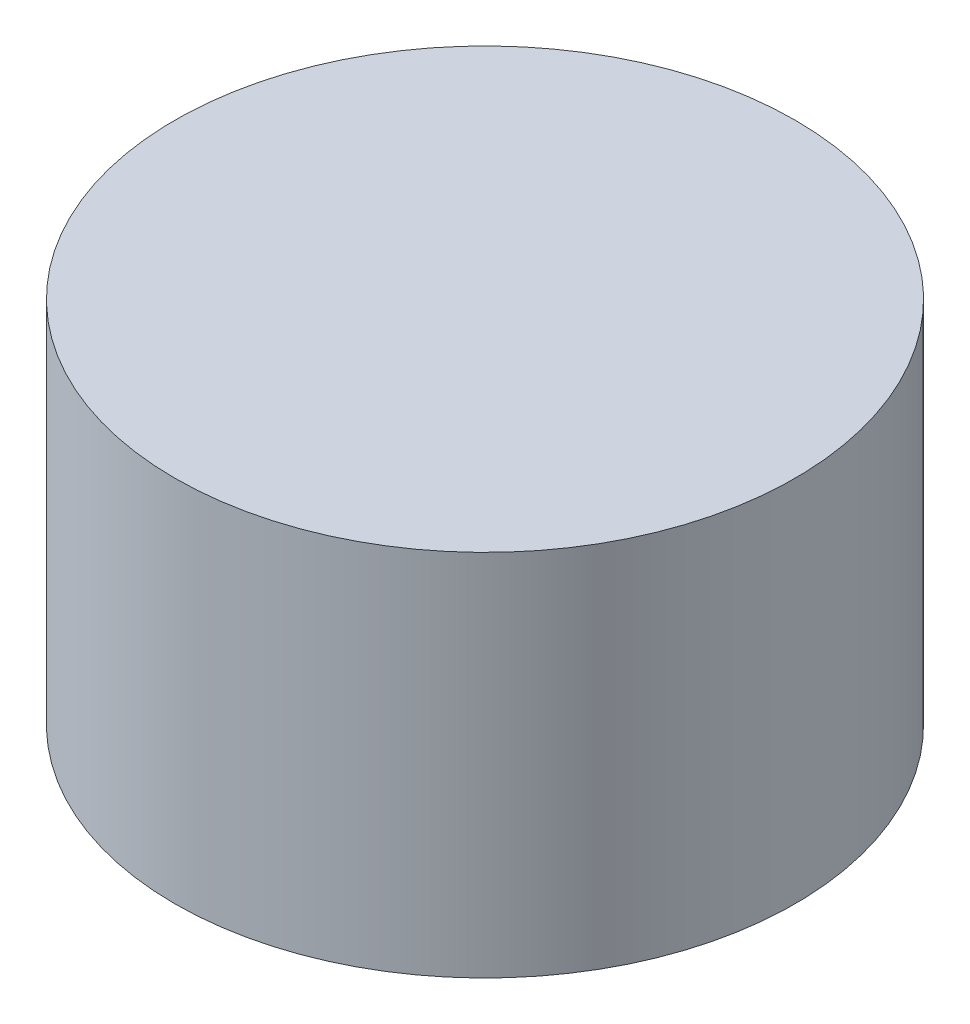
ISO-10303-21;
HEADER;
FILE_DESCRIPTION(('STEP AP214'),'2;1');
FILE_NAME('part.step','',(''),(''),'','','');
FILE_SCHEMA(('AUTOMOTIVE_DESIGN { 1 0 10303 214 1 1 1 1 }'));
ENDSEC;
DATA;
#1=APPLICATION_CONTEXT('core data for automotive mechanical design processes');
#2=APPLICATION_PROTOCOL_DEFINITION('international standard','automotive_design',2000,#1);
#3=PRODUCT_CONTEXT('',#1,'mechanical');
#4=PRODUCT('Part','Part','',(#3));
#5=PRODUCT_RELATED_PRODUCT_CATEGORY('part','',(#4));
#6=PRODUCT_DEFINITION_FORMATION('','',#4);
#7=PRODUCT_DEFINITION_CONTEXT('part definition',#1,'design');
#8=PRODUCT_DEFINITION('design','',#6,#7);
#9=PRODUCT_DEFINITION_SHAPE('','',#8);
#10=(LENGTH_UNIT() NAMED_UNIT(*) SI_UNIT(.MILLI.,.METRE.));
#11=(NAMED_UNIT(*) PLANE_ANGLE_UNIT() SI_UNIT($,.RADIAN.));
#12=(NAMED_UNIT(*) SI_UNIT($,.STERADIAN.) SOLID_ANGLE_UNIT());
#13=UNCERTAINTY_MEASURE_WITH_UNIT(LENGTH_MEASURE(1.E-05),#10,'distance_accuracy_value','');
#14=(GEOMETRIC_REPRESENTATION_CONTEXT(3) GLOBAL_UNCERTAINTY_ASSIGNED_CONTEXT((#13)) GLOBAL_UNIT_ASSIGNED_CONTEXT((#10,
#11,#12)) REPRESENTATION_CONTEXT('',''));
#15=CARTESIAN_POINT('',(0.,0.,0.));
#16=DIRECTION('',(0.,0.,1.));
#17=DIRECTION('',(1.,0.,0.));
#18=AXIS2_PLACEMENT_3D('',#15,#16,#17);
#19=CARTESIAN_POINT('',(0.,6.35,0.));
#20=DIRECTION('',(0.,-1.,0.));
#21=DIRECTION('',(0.,0.,-1.));
#22=AXIS2_PLACEMENT_3D('',#19,#20,#21);
#23=CYLINDRICAL_SURFACE('',#22,9.906);
#24=CARTESIAN_POINT('',(0.,-1.016,0.));
#25=DIRECTION('',(0.,-1.,0.));
#26=DIRECTION('',(0.,0.,-1.));
#27=AXIS2_PLACEMENT_3D('',#24,#25,#26);
#28=CIRCLE('',#27,9.906);
#29=CARTESIAN_POINT('',(0.,-1.016,-9.906));
#30=VERTEX_POINT('',#29);
#31=EDGE_CURVE('E45',#30,#30,#28,.F.);
#32=ORIENTED_EDGE('',*,*,#31,.T.);
#33=EDGE_LOOP('',(#32));
#34=FACE_BOUND('',#33,.T.);
#35=CARTESIAN_POINT('',(0.,0.253999999999997,0.));
#36=DIRECTION('',(0.,1.,0.));
#37=DIRECTION('',(0.,0.,1.));
#38=AXIS2_PLACEMENT_3D('',#35,#36,#37);
#39=CIRCLE('',#38,9.906);
#40=CARTESIAN_POINT('',(0.,0.253999999999997,9.906));
#41=VERTEX_POINT('',#40);
#42=EDGE_CURVE('E49',#41,#41,#39,.F.);
#43=ORIENTED_EDGE('',*,*,#42,.T.);
#44=EDGE_LOOP('',(#43));
#45=FACE_BOUND('',#44,.T.);
#46=ADVANCED_FACE('F41',(#34,#45),#23,.T.);
#47=CARTESIAN_POINT('',(0.,-27.7643990977358,0.));
#48=DIRECTION('',(0.,1.,0.));
#49=DIRECTION('',(0.,0.,1.));
#50=AXIS2_PLACEMENT_3D('',#47,#48,#49);
#51=CYLINDRICAL_SURFACE('',#50,9.525);
#52=CARTESIAN_POINT('',(0.,0.253999999999997,0.));
#53=DIRECTION('',(0.,1.,0.));
#54=DIRECTION('',(0.,0.,1.));
#55=AXIS2_PLACEMENT_3D('',#52,#53,#54);
#56=CIRCLE('',#55,9.525);
#57=CARTESIAN_POINT('',(0.,0.253999999999997,9.525));
#58=VERTEX_POINT('',#57);
#59=EDGE_CURVE('E57',#58,#58,#56,.F.);
#60=ORIENTED_EDGE('',*,*,#59,.F.);
#61=EDGE_LOOP('',(#60));
#62=FACE_BOUND('',#61,.T.);
#63=CARTESIAN_POINT('',(0.,6.35,0.));
#64=DIRECTION('',(0.,1.,0.));
#65=DIRECTION('',(0.,0.,1.));
#66=AXIS2_PLACEMENT_3D('',#63,#64,#65);
#67=CIRCLE('',#66,9.525);
#68=CARTESIAN_POINT('',(0.,6.35,9.525));
#69=VERTEX_POINT('',#68);
#70=EDGE_CURVE('E54',#69,#69,#67,.T.);
#71=ORIENTED_EDGE('',*,*,#70,.F.);
#72=EDGE_LOOP('',(#71));
#73=FACE_BOUND('',#72,.T.);
#74=ADVANCED_FACE('F80',(#62,#73),#51,.T.);
#75=CARTESIAN_POINT('',(-26.7335,0.253999999999999,-12.446));
#76=DIRECTION('',(0.,1.,0.));
#77=DIRECTION('',(-1.,0.,0.));
#78=AXIS2_PLACEMENT_3D('',#75,#76,#77);
#79=PLANE('',#78);
#80=ORIENTED_EDGE('',*,*,#42,.F.);
#81=EDGE_LOOP('',(#80));
#82=FACE_BOUND('',#81,.T.);
#83=ORIENTED_EDGE('',*,*,#59,.T.);
#84=EDGE_LOOP('',(#83));
#85=FACE_BOUND('',#84,.T.);
#86=ADVANCED_FACE('F78',(#82,#85),#79,.T.);
#87=CARTESIAN_POINT('',(0.,6.35,0.));
#88=DIRECTION('',(0.,1.,0.));
#89=DIRECTION('',(0.,0.,1.));
#90=AXIS2_PLACEMENT_3D('',#87,#88,#89);
#91=PLANE('',#90);
#92=CARTESIAN_POINT('',(0.,6.35,0.));
#93=DIRECTION('',(0.,1.,0.));
#94=DIRECTION('',(0.,0.,1.));
#95=AXIS2_PLACEMENT_3D('',#92,#93,#94);
#96=CIRCLE('',#95,6.604);
#97=CARTESIAN_POINT('',(0.,6.35,6.604));
#98=VERTEX_POINT('',#97);
#99=EDGE_CURVE('E61',#98,#98,#96,.T.);
#100=ORIENTED_EDGE('',*,*,#99,.F.);
#101=EDGE_LOOP('',(#100));
#102=FACE_BOUND('',#101,.T.);
#103=ORIENTED_EDGE('',*,*,#70,.T.);
#104=EDGE_LOOP('',(#103));
#105=FACE_BOUND('',#104,.T.);
#106=ADVANCED_FACE('F88',(#102,#105),#91,.T.);
#107=CARTESIAN_POINT('',(0.,-3.048,0.));
#108=DIRECTION('',(0.,1.,0.));
#109=DIRECTION('',(0.,0.,1.));
#110=AXIS2_PLACEMENT_3D('',#107,#108,#109);
#111=TOROIDAL_SURFACE('',#110,12.3455903344619,3.175);
#112=CARTESIAN_POINT('',(0.,-5.08,0.));
#113=DIRECTION('',(0.,1.,0.));
#114=DIRECTION('',(0.,0.,1.));
#115=AXIS2_PLACEMENT_3D('',#112,#113,#114);
#116=CIRCLE('',#115,9.906);
#117=CARTESIAN_POINT('',(0.,-5.08,9.906));
#118=VERTEX_POINT('',#117);
#119=EDGE_CURVE('E59',#118,#118,#116,.F.);
#120=ORIENTED_EDGE('',*,*,#119,.F.);
#121=EDGE_LOOP('',(#120));
#122=FACE_BOUND('',#121,.T.);
#123=ORIENTED_EDGE('',*,*,#31,.F.);
#124=EDGE_LOOP('',(#123));
#125=FACE_BOUND('',#124,.T.);
#126=ADVANCED_FACE('F96',(#122,#125),#111,.F.);
#127=CARTESIAN_POINT('',(0.,-6.35,0.));
#128=DIRECTION('',(0.,1.,0.));
#129=DIRECTION('',(0.,0.,1.));
#130=AXIS2_PLACEMENT_3D('',#127,#128,#129);
#131=PLANE('',#130);
#132=CARTESIAN_POINT('',(0.,-6.35,0.));
#133=DIRECTION('',(0.,-1.,0.));
#134=DIRECTION('',(0.,0.,-1.));
#135=AXIS2_PLACEMENT_3D('',#132,#133,#134);
#136=CIRCLE('',#135,6.604);
#137=CARTESIAN_POINT('',(0.,-6.35,-6.604));
#138=VERTEX_POINT('',#137);
#139=EDGE_CURVE('E66',#138,#138,#136,.T.);
#140=ORIENTED_EDGE('',*,*,#139,.F.);
#141=EDGE_LOOP('',(#140));
#142=FACE_BOUND('',#141,.T.);
#143=CARTESIAN_POINT('',(0.,-6.35,0.));
#144=DIRECTION('',(0.,1.,0.));
#145=DIRECTION('',(0.,0.,1.));
#146=AXIS2_PLACEMENT_3D('',#143,#144,#145);
#147=CIRCLE('',#146,9.906);
#148=CARTESIAN_POINT('',(0.,-6.35,9.906));
#149=VERTEX_POINT('',#148);
#150=EDGE_CURVE('E11',#149,#149,#147,.T.);
#151=ORIENTED_EDGE('',*,*,#150,.F.);
#152=EDGE_LOOP('',(#151));
#153=FACE_BOUND('',#152,.T.);
#154=ADVANCED_FACE('F98',(#142,#153),#131,.F.);
#155=ORIENTED_EDGE('',*,*,#119,.T.);
#156=EDGE_LOOP('',(#155));
#157=FACE_BOUND('',#156,.T.);
#158=ORIENTED_EDGE('',*,*,#150,.T.);
#159=EDGE_LOOP('',(#158));
#160=FACE_BOUND('',#159,.T.);
#161=ADVANCED_FACE('F43',(#157,#160),#23,.T.);
#162=CARTESIAN_POINT('',(0.,6.604,0.));
#163=DIRECTION('',(0.,-1.,0.));
#164=DIRECTION('',(0.,0.,-1.));
#165=AXIS2_PLACEMENT_3D('',#162,#163,#164);
#166=CYLINDRICAL_SURFACE('',#165,6.604);
#167=ORIENTED_EDGE('',*,*,#99,.T.);
#168=EDGE_LOOP('',(#167));
#169=FACE_BOUND('',#168,.T.);
#170=ORIENTED_EDGE('',*,*,#139,.T.);
#171=EDGE_LOOP('',(#170));
#172=FACE_BOUND('',#171,.T.);
#173=ADVANCED_FACE('F105',(#169,#172),#166,.F.);
#174=CLOSED_SHELL('',(#46,#74,#86,#106,#126,#154,#161,#173));
#175=MANIFOLD_SOLID_BREP('B2',#174);
#176=CARTESIAN_POINT('',(0.,6.604,0.));
#177=DIRECTION('',(0.,-1.,0.));
#178=DIRECTION('',(0.,0.,-1.));
#179=AXIS2_PLACEMENT_3D('',#176,#177,#178);
#180=CYLINDRICAL_SURFACE('',#179,11.1125);
#181=CARTESIAN_POINT('',(0.,6.604,0.));
#182=DIRECTION('',(0.,1.,0.));
#183=DIRECTION('',(0.,0.,1.));
#184=AXIS2_PLACEMENT_3D('',#181,#182,#183);
#185=CIRCLE('',#184,11.1125);
#186=CARTESIAN_POINT('',(0.,6.604,-11.1125));
#187=VERTEX_POINT('',#186);
#188=EDGE_CURVE('E40',#187,#187,#185,.T.);
#189=CARTESIAN_POINT('',(0.,-6.604,0.));
#190=DIRECTION('',(0.,1.,0.));
#191=DIRECTION('',(0.,0.,1.));
#192=AXIS2_PLACEMENT_3D('',#189,#190,#191);
#193=CIRCLE('',#192,11.1125);
#194=CARTESIAN_POINT('',(0.,-6.604,-11.1125));
#195=VERTEX_POINT('',#194);
#196=EDGE_CURVE('E164',#195,#195,#193,.T.);
#197=CARTESIAN_POINT('',(0.,6.604,-11.1125));
#198=CARTESIAN_POINT('',(0.,6.46641666666667,-11.1125));
#199=CARTESIAN_POINT('',(0.,6.32883333333333,-11.1125));
#200=CARTESIAN_POINT('',(0.,6.05366666666667,-11.1125));
#201=CARTESIAN_POINT('',(0.,5.91608333333333,-11.1125));
#202=CARTESIAN_POINT('',(0.,5.64091666666667,-11.1125));
#203=CARTESIAN_POINT('',(0.,5.50333333333333,-11.1125));
#204=CARTESIAN_POINT('',(0.,5.22816666666667,-11.1125));
#205=CARTESIAN_POINT('',(0.,5.09058333333333,-11.1125));
#206=CARTESIAN_POINT('',(0.,4.81541666666667,-11.1125));
#207=CARTESIAN_POINT('',(0.,4.67783333333333,-11.1125));
#208=CARTESIAN_POINT('',(0.,4.40266666666667,-11.1125));
#209=CARTESIAN_POINT('',(0.,4.26508333333333,-11.1125));
#210=CARTESIAN_POINT('',(0.,3.98991666666667,-11.1125));
#211=CARTESIAN_POINT('',(0.,3.85233333333333,-11.1125));
#212=CARTESIAN_POINT('',(0.,3.57716666666667,-11.1125));
#213=CARTESIAN_POINT('',(0.,3.43958333333333,-11.1125));
#214=CARTESIAN_POINT('',(0.,3.16441666666667,-11.1125));
#215=CARTESIAN_POINT('',(0.,3.02683333333333,-11.1125));
#216=CARTESIAN_POINT('',(0.,2.75166666666667,-11.1125));
#217=CARTESIAN_POINT('',(0.,2.61408333333333,-11.1125));
#218=CARTESIAN_POINT('',(0.,2.33891666666667,-11.1125));
#219=CARTESIAN_POINT('',(0.,2.20133333333333,-11.1125));
#220=CARTESIAN_POINT('',(0.,1.92616666666667,-11.1125));
#221=CARTESIAN_POINT('',(0.,1.78858333333333,-11.1125));
#222=CARTESIAN_POINT('',(0.,1.51341666666667,-11.1125));
#223=CARTESIAN_POINT('',(0.,1.37583333333333,-11.1125));
#224=CARTESIAN_POINT('',(0.,1.10066666666667,-11.1125));
#225=CARTESIAN_POINT('',(0.,0.963083333333332,-11.1125));
#226=CARTESIAN_POINT('',(0.,0.687916666666666,-11.1125));
#227=CARTESIAN_POINT('',(0.,0.550333333333332,-11.1125));
#228=CARTESIAN_POINT('',(0.,0.275166666666666,-11.1125));
#229=CARTESIAN_POINT('',(0.,0.137583333333332,-11.1125));
#230=CARTESIAN_POINT('',(0.,-0.137583333333334,-11.1125));
#231=CARTESIAN_POINT('',(0.,-0.275166666666668,-11.1125));
#232=CARTESIAN_POINT('',(0.,-0.550333333333334,-11.1125));
#233=CARTESIAN_POINT('',(0.,-0.687916666666667,-11.1125));
#234=CARTESIAN_POINT('',(0.,-0.963083333333333,-11.1125));
#235=CARTESIAN_POINT('',(0.,-1.10066666666667,-11.1125));
#236=CARTESIAN_POINT('',(0.,-1.37583333333333,-11.1125));
#237=CARTESIAN_POINT('',(0.,-1.51341666666667,-11.1125));
#238=CARTESIAN_POINT('',(0.,-1.78858333333333,-11.1125));
#239=CARTESIAN_POINT('',(0.,-1.92616666666667,-11.1125));
#240=CARTESIAN_POINT('',(0.,-2.20133333333333,-11.1125));
#241=CARTESIAN_POINT('',(0.,-2.33891666666667,-11.1125));
#242=CARTESIAN_POINT('',(0.,-2.61408333333333,-11.1125));
#243=CARTESIAN_POINT('',(0.,-2.75166666666667,-11.1125));
#244=CARTESIAN_POINT('',(0.,-3.02683333333333,-11.1125));
#245=CARTESIAN_POINT('',(0.,-3.16441666666667,-11.1125));
#246=CARTESIAN_POINT('',(0.,-3.43958333333333,-11.1125));
#247=CARTESIAN_POINT('',(0.,-3.57716666666667,-11.1125));
#248=CARTESIAN_POINT('',(0.,-3.85233333333333,-11.1125));
#249=CARTESIAN_POINT('',(0.,-3.98991666666667,-11.1125));
#250=CARTESIAN_POINT('',(0.,-4.26508333333333,-11.1125));
#251=CARTESIAN_POINT('',(0.,-4.40266666666667,-11.1125));
#252=CARTESIAN_POINT('',(0.,-4.67783333333333,-11.1125));
#253=CARTESIAN_POINT('',(0.,-4.81541666666667,-11.1125));
#254=CARTESIAN_POINT('',(0.,-5.09058333333333,-11.1125));
#255=CARTESIAN_POINT('',(0.,-5.22816666666667,-11.1125));
#256=CARTESIAN_POINT('',(0.,-5.50333333333333,-11.1125));
#257=CARTESIAN_POINT('',(0.,-5.64091666666667,-11.1125));
#258=CARTESIAN_POINT('',(0.,-5.91608333333333,-11.1125));
#259=CARTESIAN_POINT('',(0.,-6.05366666666667,-11.1125));
#260=CARTESIAN_POINT('',(0.,-6.32883333333333,-11.1125));
#261=CARTESIAN_POINT('',(0.,-6.46641666666667,-11.1125));
#262=CARTESIAN_POINT('',(0.,-6.604,-11.1125));
#263=B_SPLINE_CURVE_WITH_KNOTS('',3,(#197,#198,#199,#200,#201,#202,#203,#204,#205,#206,#207,
#208,#209,#210,#211,#212,#213,#214,#215,#216,#217,#218,#219,#220,#221,#222,#223,#224,#225,#226,
#227,#228,#229,#230,#231,#232,#233,#234,#235,#236,#237,#238,#239,#240,#241,#242,#243,#244,#245,
#246,#247,#248,#249,#250,#251,#252,#253,#254,#255,#256,#257,#258,#259,#260,#261,#262),
.UNSPECIFIED.,.F.,.F.,(4,2,2,2,2,2,2,2,2,2,2,2,2,2,2,2,2,2,2,2,2,2,2,2,2,2,2,2,2,2,2,2,4),(0.,
0.41275,0.8255,1.23825,1.651,2.06375,2.4765,2.88925,3.302,3.71475,4.1275,4.54025,4.953,5.36575,
5.7785,6.19125,6.604,7.01675,7.4295,7.84225,8.255,8.66775,9.0805,9.49325,9.906,10.31875,10.7315,
11.14425,11.557,11.96975,12.3825,12.79525,13.208),.UNSPECIFIED.);
#264=EDGE_CURVE('BSEAM161',#187,#195,#263,.T.);
#265=ORIENTED_EDGE('',*,*,#188,.F.);
#266=ORIENTED_EDGE('',*,*,#196,.T.);
#267=ORIENTED_EDGE('',*,*,#264,.T.);
#268=ORIENTED_EDGE('',*,*,#264,.F.);
#269=EDGE_LOOP('',(#265,#267,#266,#268));
#270=FACE_BOUND('',#269,.T.);
#271=ADVANCED_FACE('F161',(#270),#180,.T.);
#272=CARTESIAN_POINT('',(0.,6.604,0.));
#273=DIRECTION('',(0.,1.,0.));
#274=DIRECTION('',(0.,0.,1.));
#275=AXIS2_PLACEMENT_3D('',#272,#273,#274);
#276=PLANE('',#275);
#277=ORIENTED_EDGE('',*,*,#188,.T.);
#278=EDGE_LOOP('',(#277));
#279=FACE_BOUND('',#278,.T.);
#280=ADVANCED_FACE('F176',(#279),#276,.T.);
#281=CARTESIAN_POINT('',(0.,-6.604,0.));
#282=DIRECTION('',(0.,1.,0.));
#283=DIRECTION('',(0.,0.,1.));
#284=AXIS2_PLACEMENT_3D('',#281,#282,#283);
#285=PLANE('',#284);
#286=ORIENTED_EDGE('',*,*,#196,.F.);
#287=EDGE_LOOP('',(#286));
#288=FACE_BOUND('',#287,.T.);
#289=ADVANCED_FACE('F174',(#288),#285,.F.);
#290=CLOSED_SHELL('',(#271,#280,#289));
#291=MANIFOLD_SOLID_BREP('B6_NOT_SHOWN',#290);
#292=ADVANCED_BREP_SHAPE_REPRESENTATION('',(#18,#175,#291),#14);
#293=SHAPE_DEFINITION_REPRESENTATION(#9,#292);
ENDSEC;
END-ISO-10303-21;
